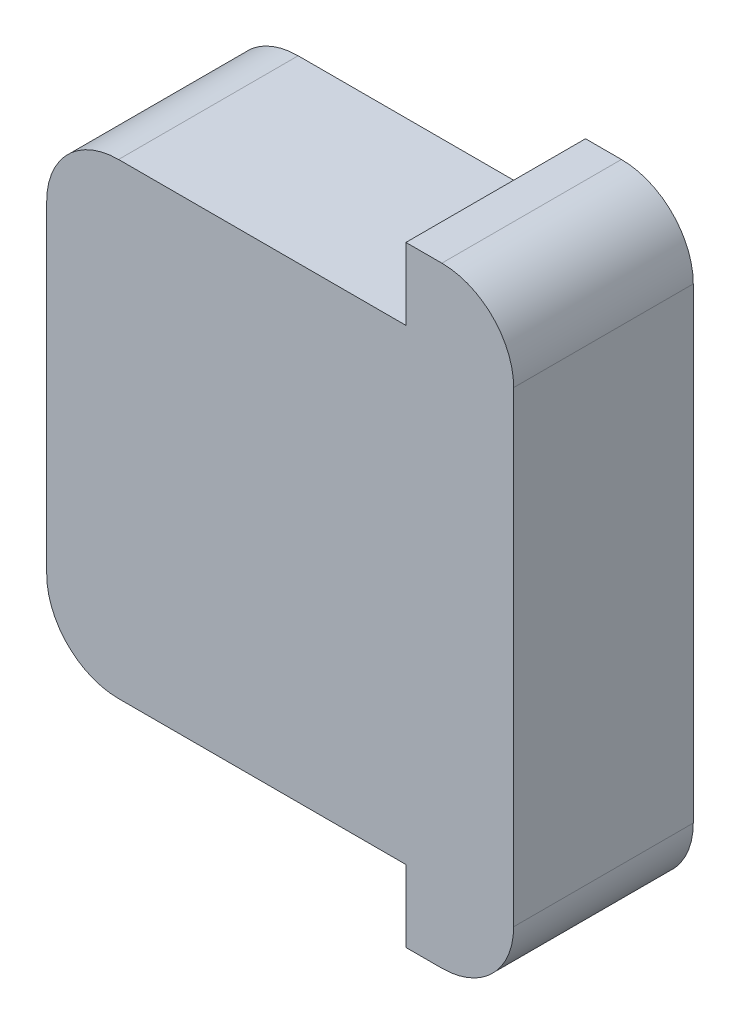
ISO-10303-21;
HEADER;
FILE_DESCRIPTION(('STEP AP214'),'2;1');
FILE_NAME('part.step','',(''),(''),'','','');
FILE_SCHEMA(('AUTOMOTIVE_DESIGN { 1 0 10303 214 1 1 1 1 }'));
ENDSEC;
DATA;
#1=APPLICATION_CONTEXT('core data for automotive mechanical design processes');
#2=APPLICATION_PROTOCOL_DEFINITION('international standard','automotive_design',2000,#1);
#3=PRODUCT_CONTEXT('',#1,'mechanical');
#4=PRODUCT('Part','Part','',(#3));
#5=PRODUCT_RELATED_PRODUCT_CATEGORY('part','',(#4));
#6=PRODUCT_DEFINITION_FORMATION('','',#4);
#7=PRODUCT_DEFINITION_CONTEXT('part definition',#1,'design');
#8=PRODUCT_DEFINITION('design','',#6,#7);
#9=PRODUCT_DEFINITION_SHAPE('','',#8);
#10=(LENGTH_UNIT() NAMED_UNIT(*) SI_UNIT(.MILLI.,.METRE.));
#11=(NAMED_UNIT(*) PLANE_ANGLE_UNIT() SI_UNIT($,.RADIAN.));
#12=(NAMED_UNIT(*) SI_UNIT($,.STERADIAN.) SOLID_ANGLE_UNIT());
#13=UNCERTAINTY_MEASURE_WITH_UNIT(LENGTH_MEASURE(1.E-05),#10,'distance_accuracy_value','');
#14=(GEOMETRIC_REPRESENTATION_CONTEXT(3) GLOBAL_UNCERTAINTY_ASSIGNED_CONTEXT((#13)) GLOBAL_UNIT_ASSIGNED_CONTEXT((#10,
#11,#12)) REPRESENTATION_CONTEXT('',''));
#15=CARTESIAN_POINT('',(0.,0.,0.));
#16=DIRECTION('',(0.,0.,1.));
#17=DIRECTION('',(1.,0.,0.));
#18=AXIS2_PLACEMENT_3D('',#15,#16,#17);
#19=CARTESIAN_POINT('',(-10.,6.5,5.));
#20=DIRECTION('',(1.,0.,0.));
#21=DIRECTION('',(0.,1.,0.));
#22=AXIS2_PLACEMENT_3D('',#19,#20,#21);
#23=PLANE('',#22);
#24=DIRECTION('',(0.,-1.,0.));
#25=VECTOR('',#24,1.);
#26=CARTESIAN_POINT('',(-10.,6.5,0.));
#27=LINE('',#26,#25);
#28=CARTESIAN_POINT('',(-10.,4.5,0.));
#29=VERTEX_POINT('',#28);
#30=CARTESIAN_POINT('',(-10.,-4.5,0.));
#31=VERTEX_POINT('',#30);
#32=EDGE_CURVE('E167',#29,#31,#27,.T.);
#33=ORIENTED_EDGE('',*,*,#32,.T.);
#34=DIRECTION('',(0.,0.,-1.));
#35=VECTOR('',#34,1.);
#36=CARTESIAN_POINT('',(-10.,-4.5,5.));
#37=LINE('',#36,#35);
#38=CARTESIAN_POINT('',(-10.,-4.5,5.));
#39=VERTEX_POINT('',#38);
#40=EDGE_CURVE('E203',#31,#39,#37,.F.);
#41=ORIENTED_EDGE('',*,*,#40,.T.);
#42=DIRECTION('',(0.,-1.,0.));
#43=VECTOR('',#42,1.);
#44=CARTESIAN_POINT('',(-10.,6.5,5.));
#45=LINE('',#44,#43);
#46=CARTESIAN_POINT('',(-10.,4.5,5.));
#47=VERTEX_POINT('',#46);
#48=EDGE_CURVE('E138',#47,#39,#45,.T.);
#49=ORIENTED_EDGE('',*,*,#48,.F.);
#50=DIRECTION('',(0.,0.,-1.));
#51=VECTOR('',#50,1.);
#52=CARTESIAN_POINT('',(-10.,4.5,5.));
#53=LINE('',#52,#51);
#54=EDGE_CURVE('E200',#47,#29,#53,.T.);
#55=ORIENTED_EDGE('',*,*,#54,.T.);
#56=EDGE_LOOP('',(#33,#41,#49,#55));
#57=FACE_BOUND('',#56,.T.);
#58=ADVANCED_FACE('F37',(#57),#23,.F.);
#59=CARTESIAN_POINT('',(-10.,-6.5,5.));
#60=DIRECTION('',(0.,1.,0.));
#61=DIRECTION('',(-1.,0.,0.));
#62=AXIS2_PLACEMENT_3D('',#59,#60,#61);
#63=PLANE('',#62);
#64=DIRECTION('',(1.,0.,0.));
#65=VECTOR('',#64,1.);
#66=CARTESIAN_POINT('',(-10.,-6.5,5.));
#67=LINE('',#66,#65);
#68=CARTESIAN_POINT('',(-8.,-6.5,5.));
#69=VERTEX_POINT('',#68);
#70=CARTESIAN_POINT('',(0.,-6.5,5.));
#71=VERTEX_POINT('',#70);
#72=EDGE_CURVE('E125',#69,#71,#67,.T.);
#73=ORIENTED_EDGE('',*,*,#72,.F.);
#74=DIRECTION('',(0.,0.,-1.));
#75=VECTOR('',#74,1.);
#76=CARTESIAN_POINT('',(-8.,-6.5,5.));
#77=LINE('',#76,#75);
#78=CARTESIAN_POINT('',(-8.,-6.5,0.));
#79=VERTEX_POINT('',#78);
#80=EDGE_CURVE('E147',#69,#79,#77,.T.);
#81=ORIENTED_EDGE('',*,*,#80,.T.);
#82=DIRECTION('',(1.,0.,0.));
#83=VECTOR('',#82,1.);
#84=CARTESIAN_POINT('',(-10.,-6.5,0.));
#85=LINE('',#84,#83);
#86=CARTESIAN_POINT('',(0.,-6.5,0.));
#87=VERTEX_POINT('',#86);
#88=EDGE_CURVE('E144',#79,#87,#85,.T.);
#89=ORIENTED_EDGE('',*,*,#88,.T.);
#90=DIRECTION('',(0.,0.,-1.));
#91=VECTOR('',#90,1.);
#92=CARTESIAN_POINT('',(0.,-6.5,5.));
#93=LINE('',#92,#91);
#94=EDGE_CURVE('E141',#71,#87,#93,.T.);
#95=ORIENTED_EDGE('',*,*,#94,.F.);
#96=EDGE_LOOP('',(#73,#81,#89,#95));
#97=FACE_BOUND('',#96,.T.);
#98=ADVANCED_FACE('F142',(#97),#63,.F.);
#99=CARTESIAN_POINT('',(0.,-8.5,5.));
#100=DIRECTION('',(1.,0.,0.));
#101=DIRECTION('',(0.,1.,0.));
#102=AXIS2_PLACEMENT_3D('',#99,#100,#101);
#103=PLANE('',#102);
#104=DIRECTION('',(0.,-1.,0.));
#105=VECTOR('',#104,1.);
#106=CARTESIAN_POINT('',(0.,-8.5,0.));
#107=LINE('',#106,#105);
#108=CARTESIAN_POINT('',(0.,-8.5,0.));
#109=VERTEX_POINT('',#108);
#110=EDGE_CURVE('E171',#87,#109,#107,.T.);
#111=ORIENTED_EDGE('',*,*,#110,.T.);
#112=DIRECTION('',(0.,0.,-1.));
#113=VECTOR('',#112,1.);
#114=CARTESIAN_POINT('',(0.,-8.5,5.));
#115=LINE('',#114,#113);
#116=CARTESIAN_POINT('',(0.,-8.5,5.));
#117=VERTEX_POINT('',#116);
#118=EDGE_CURVE('E148',#117,#109,#115,.T.);
#119=ORIENTED_EDGE('',*,*,#118,.F.);
#120=DIRECTION('',(0.,-1.,0.));
#121=VECTOR('',#120,1.);
#122=CARTESIAN_POINT('',(0.,-8.5,5.));
#123=LINE('',#122,#121);
#124=EDGE_CURVE('E131',#71,#117,#123,.T.);
#125=ORIENTED_EDGE('',*,*,#124,.F.);
#126=ORIENTED_EDGE('',*,*,#94,.T.);
#127=EDGE_LOOP('',(#111,#119,#125,#126));
#128=FACE_BOUND('',#127,.T.);
#129=ADVANCED_FACE('F150',(#128),#103,.F.);
#130=CARTESIAN_POINT('',(3.,-8.5,5.));
#131=DIRECTION('',(0.,1.,0.));
#132=DIRECTION('',(0.,0.,1.));
#133=AXIS2_PLACEMENT_3D('',#130,#131,#132);
#134=PLANE('',#133);
#135=DIRECTION('',(1.,0.,0.));
#136=VECTOR('',#135,1.);
#137=CARTESIAN_POINT('',(3.,-8.5,0.));
#138=LINE('',#137,#136);
#139=CARTESIAN_POINT('',(1.,-8.5,0.));
#140=VERTEX_POINT('',#139);
#141=EDGE_CURVE('E173',#109,#140,#138,.T.);
#142=ORIENTED_EDGE('',*,*,#141,.T.);
#143=DIRECTION('',(0.,0.,-1.));
#144=VECTOR('',#143,1.);
#145=CARTESIAN_POINT('',(1.,-8.5,5.));
#146=LINE('',#145,#144);
#147=CARTESIAN_POINT('',(1.,-8.5,5.));
#148=VERTEX_POINT('',#147);
#149=EDGE_CURVE('E216',#140,#148,#146,.F.);
#150=ORIENTED_EDGE('',*,*,#149,.T.);
#151=DIRECTION('',(1.,0.,0.));
#152=VECTOR('',#151,1.);
#153=CARTESIAN_POINT('',(3.,-8.5,5.));
#154=LINE('',#153,#152);
#155=EDGE_CURVE('E153',#117,#148,#154,.T.);
#156=ORIENTED_EDGE('',*,*,#155,.F.);
#157=ORIENTED_EDGE('',*,*,#118,.T.);
#158=EDGE_LOOP('',(#142,#150,#156,#157));
#159=FACE_BOUND('',#158,.T.);
#160=ADVANCED_FACE('F263',(#159),#134,.F.);
#161=CARTESIAN_POINT('',(3.,8.5,5.));
#162=DIRECTION('',(-1.,0.,0.));
#163=DIRECTION('',(0.,-1.,0.));
#164=AXIS2_PLACEMENT_3D('',#161,#162,#163);
#165=PLANE('',#164);
#166=DIRECTION('',(0.,1.,0.));
#167=VECTOR('',#166,1.);
#168=CARTESIAN_POINT('',(3.,8.5,5.));
#169=LINE('',#168,#167);
#170=CARTESIAN_POINT('',(3.,-6.5,5.));
#171=VERTEX_POINT('',#170);
#172=CARTESIAN_POINT('',(3.,6.5,5.));
#173=VERTEX_POINT('',#172);
#174=EDGE_CURVE('E155',#171,#173,#169,.T.);
#175=ORIENTED_EDGE('',*,*,#174,.F.);
#176=DIRECTION('',(0.,0.,-1.));
#177=VECTOR('',#176,1.);
#178=CARTESIAN_POINT('',(3.,-6.5,5.));
#179=LINE('',#178,#177);
#180=CARTESIAN_POINT('',(3.,-6.5,0.));
#181=VERTEX_POINT('',#180);
#182=EDGE_CURVE('E213',#171,#181,#179,.T.);
#183=ORIENTED_EDGE('',*,*,#182,.T.);
#184=DIRECTION('',(0.,1.,0.));
#185=VECTOR('',#184,1.);
#186=CARTESIAN_POINT('',(3.,8.5,0.));
#187=LINE('',#186,#185);
#188=CARTESIAN_POINT('',(3.,6.5,0.));
#189=VERTEX_POINT('',#188);
#190=EDGE_CURVE('E176',#181,#189,#187,.T.);
#191=ORIENTED_EDGE('',*,*,#190,.T.);
#192=DIRECTION('',(0.,0.,-1.));
#193=VECTOR('',#192,1.);
#194=CARTESIAN_POINT('',(3.,6.5,5.));
#195=LINE('',#194,#193);
#196=EDGE_CURVE('E211',#189,#173,#195,.F.);
#197=ORIENTED_EDGE('',*,*,#196,.T.);
#198=EDGE_LOOP('',(#175,#183,#191,#197));
#199=FACE_BOUND('',#198,.T.);
#200=ADVANCED_FACE('F266',(#199),#165,.F.);
#201=CARTESIAN_POINT('',(0.,8.5,5.));
#202=DIRECTION('',(0.,-1.,0.));
#203=DIRECTION('',(0.,0.,-1.));
#204=AXIS2_PLACEMENT_3D('',#201,#202,#203);
#205=PLANE('',#204);
#206=DIRECTION('',(-1.,0.,0.));
#207=VECTOR('',#206,1.);
#208=CARTESIAN_POINT('',(0.,8.5,5.));
#209=LINE('',#208,#207);
#210=CARTESIAN_POINT('',(1.,8.5,5.));
#211=VERTEX_POINT('',#210);
#212=CARTESIAN_POINT('',(0.,8.5,5.));
#213=VERTEX_POINT('',#212);
#214=EDGE_CURVE('E160',#211,#213,#209,.T.);
#215=ORIENTED_EDGE('',*,*,#214,.F.);
#216=DIRECTION('',(0.,0.,-1.));
#217=VECTOR('',#216,1.);
#218=CARTESIAN_POINT('',(1.,8.5,5.));
#219=LINE('',#218,#217);
#220=CARTESIAN_POINT('',(1.,8.5,0.));
#221=VERTEX_POINT('',#220);
#222=EDGE_CURVE('E45',#211,#221,#219,.T.);
#223=ORIENTED_EDGE('',*,*,#222,.T.);
#224=DIRECTION('',(-1.,0.,0.));
#225=VECTOR('',#224,1.);
#226=CARTESIAN_POINT('',(0.,8.5,0.));
#227=LINE('',#226,#225);
#228=CARTESIAN_POINT('',(0.,8.5,0.));
#229=VERTEX_POINT('',#228);
#230=EDGE_CURVE('E179',#221,#229,#227,.T.);
#231=ORIENTED_EDGE('',*,*,#230,.T.);
#232=DIRECTION('',(0.,0.,-1.));
#233=VECTOR('',#232,1.);
#234=CARTESIAN_POINT('',(0.,8.5,5.));
#235=LINE('',#234,#233);
#236=EDGE_CURVE('E187',#213,#229,#235,.T.);
#237=ORIENTED_EDGE('',*,*,#236,.F.);
#238=EDGE_LOOP('',(#215,#223,#231,#237));
#239=FACE_BOUND('',#238,.T.);
#240=ADVANCED_FACE('F221',(#239),#205,.F.);
#241=CARTESIAN_POINT('',(0.,6.5,5.));
#242=DIRECTION('',(1.,0.,0.));
#243=DIRECTION('',(0.,0.,-1.));
#244=AXIS2_PLACEMENT_3D('',#241,#242,#243);
#245=PLANE('',#244);
#246=DIRECTION('',(0.,-1.,0.));
#247=VECTOR('',#246,1.);
#248=CARTESIAN_POINT('',(0.,6.5,0.));
#249=LINE('',#248,#247);
#250=CARTESIAN_POINT('',(0.,6.5,0.));
#251=VERTEX_POINT('',#250);
#252=EDGE_CURVE('E181',#229,#251,#249,.T.);
#253=ORIENTED_EDGE('',*,*,#252,.T.);
#254=DIRECTION('',(0.,0.,-1.));
#255=VECTOR('',#254,1.);
#256=CARTESIAN_POINT('',(0.,6.5,5.));
#257=LINE('',#256,#255);
#258=CARTESIAN_POINT('',(0.,6.5,5.));
#259=VERTEX_POINT('',#258);
#260=EDGE_CURVE('E166',#259,#251,#257,.T.);
#261=ORIENTED_EDGE('',*,*,#260,.F.);
#262=DIRECTION('',(0.,-1.,0.));
#263=VECTOR('',#262,1.);
#264=CARTESIAN_POINT('',(0.,6.5,5.));
#265=LINE('',#264,#263);
#266=EDGE_CURVE('E162',#213,#259,#265,.T.);
#267=ORIENTED_EDGE('',*,*,#266,.F.);
#268=ORIENTED_EDGE('',*,*,#236,.T.);
#269=EDGE_LOOP('',(#253,#261,#267,#268));
#270=FACE_BOUND('',#269,.T.);
#271=ADVANCED_FACE('F231',(#270),#245,.F.);
#272=CARTESIAN_POINT('',(-10.,6.5,5.));
#273=DIRECTION('',(0.,-1.,0.));
#274=DIRECTION('',(0.,0.,-1.));
#275=AXIS2_PLACEMENT_3D('',#272,#273,#274);
#276=PLANE('',#275);
#277=DIRECTION('',(-1.,0.,0.));
#278=VECTOR('',#277,1.);
#279=CARTESIAN_POINT('',(-10.,6.5,0.));
#280=LINE('',#279,#278);
#281=CARTESIAN_POINT('',(-8.,6.5,0.));
#282=VERTEX_POINT('',#281);
#283=EDGE_CURVE('E183',#251,#282,#280,.T.);
#284=ORIENTED_EDGE('',*,*,#283,.T.);
#285=DIRECTION('',(0.,0.,-1.));
#286=VECTOR('',#285,1.);
#287=CARTESIAN_POINT('',(-8.,6.5,5.));
#288=LINE('',#287,#286);
#289=CARTESIAN_POINT('',(-8.,6.5,5.));
#290=VERTEX_POINT('',#289);
#291=EDGE_CURVE('E11',#282,#290,#288,.F.);
#292=ORIENTED_EDGE('',*,*,#291,.T.);
#293=DIRECTION('',(-1.,0.,0.));
#294=VECTOR('',#293,1.);
#295=CARTESIAN_POINT('',(-10.,6.5,5.));
#296=LINE('',#295,#294);
#297=EDGE_CURVE('E164',#259,#290,#296,.T.);
#298=ORIENTED_EDGE('',*,*,#297,.F.);
#299=ORIENTED_EDGE('',*,*,#260,.T.);
#300=EDGE_LOOP('',(#284,#292,#298,#299));
#301=FACE_BOUND('',#300,.T.);
#302=ADVANCED_FACE('F233',(#301),#276,.F.);
#303=CARTESIAN_POINT('',(0.,0.,5.));
#304=DIRECTION('',(0.,0.,1.));
#305=DIRECTION('',(1.,0.,0.));
#306=AXIS2_PLACEMENT_3D('',#303,#304,#305);
#307=PLANE('',#306);
#308=ORIENTED_EDGE('',*,*,#48,.T.);
#309=CARTESIAN_POINT('',(-8.,-4.5,5.));
#310=DIRECTION('',(0.,0.,1.));
#311=DIRECTION('',(1.,0.,0.));
#312=AXIS2_PLACEMENT_3D('',#309,#310,#311);
#313=CIRCLE('',#312,2.);
#314=EDGE_CURVE('E134',#39,#69,#313,.T.);
#315=ORIENTED_EDGE('',*,*,#314,.T.);
#316=ORIENTED_EDGE('',*,*,#72,.T.);
#317=ORIENTED_EDGE('',*,*,#124,.T.);
#318=ORIENTED_EDGE('',*,*,#155,.T.);
#319=CARTESIAN_POINT('',(1.,-6.5,5.));
#320=DIRECTION('',(0.,0.,1.));
#321=DIRECTION('',(1.,0.,0.));
#322=AXIS2_PLACEMENT_3D('',#319,#320,#321);
#323=CIRCLE('',#322,2.);
#324=EDGE_CURVE('E208',#148,#171,#323,.T.);
#325=ORIENTED_EDGE('',*,*,#324,.T.);
#326=ORIENTED_EDGE('',*,*,#174,.T.);
#327=CARTESIAN_POINT('',(1.,6.5,5.));
#328=DIRECTION('',(0.,0.,1.));
#329=DIRECTION('',(1.,0.,0.));
#330=AXIS2_PLACEMENT_3D('',#327,#328,#329);
#331=CIRCLE('',#330,2.);
#332=EDGE_CURVE('E58',#173,#211,#331,.T.);
#333=ORIENTED_EDGE('',*,*,#332,.T.);
#334=ORIENTED_EDGE('',*,*,#214,.T.);
#335=ORIENTED_EDGE('',*,*,#266,.T.);
#336=ORIENTED_EDGE('',*,*,#297,.T.);
#337=CARTESIAN_POINT('',(-8.,4.5,5.));
#338=DIRECTION('',(0.,0.,1.));
#339=DIRECTION('',(1.,0.,0.));
#340=AXIS2_PLACEMENT_3D('',#337,#338,#339);
#341=CIRCLE('',#340,2.);
#342=EDGE_CURVE('E205',#290,#47,#341,.T.);
#343=ORIENTED_EDGE('',*,*,#342,.T.);
#344=EDGE_LOOP('',(#308,#315,#316,#317,#318,#325,#326,#333,#334,#335,#336,#343));
#345=FACE_BOUND('',#344,.T.);
#346=ADVANCED_FACE('F128',(#345),#307,.T.);
#347=CARTESIAN_POINT('',(0.,0.,0.));
#348=DIRECTION('',(0.,0.,1.));
#349=DIRECTION('',(1.,0.,0.));
#350=AXIS2_PLACEMENT_3D('',#347,#348,#349);
#351=PLANE('',#350);
#352=ORIENTED_EDGE('',*,*,#88,.F.);
#353=CARTESIAN_POINT('',(-8.,-4.5,0.));
#354=DIRECTION('',(0.,0.,1.));
#355=DIRECTION('',(1.,0.,0.));
#356=AXIS2_PLACEMENT_3D('',#353,#354,#355);
#357=CIRCLE('',#356,2.);
#358=EDGE_CURVE('E198',#79,#31,#357,.F.);
#359=ORIENTED_EDGE('',*,*,#358,.T.);
#360=ORIENTED_EDGE('',*,*,#32,.F.);
#361=CARTESIAN_POINT('',(-8.,4.5,0.));
#362=DIRECTION('',(0.,0.,1.));
#363=DIRECTION('',(1.,0.,0.));
#364=AXIS2_PLACEMENT_3D('',#361,#362,#363);
#365=CIRCLE('',#364,2.);
#366=EDGE_CURVE('E192',#29,#282,#365,.F.);
#367=ORIENTED_EDGE('',*,*,#366,.T.);
#368=ORIENTED_EDGE('',*,*,#283,.F.);
#369=ORIENTED_EDGE('',*,*,#252,.F.);
#370=ORIENTED_EDGE('',*,*,#230,.F.);
#371=CARTESIAN_POINT('',(1.,6.5,0.));
#372=DIRECTION('',(0.,0.,1.));
#373=DIRECTION('',(1.,0.,0.));
#374=AXIS2_PLACEMENT_3D('',#371,#372,#373);
#375=CIRCLE('',#374,2.);
#376=EDGE_CURVE('E194',#221,#189,#375,.F.);
#377=ORIENTED_EDGE('',*,*,#376,.T.);
#378=ORIENTED_EDGE('',*,*,#190,.F.);
#379=CARTESIAN_POINT('',(1.,-6.5,0.));
#380=DIRECTION('',(0.,0.,1.));
#381=DIRECTION('',(1.,0.,0.));
#382=AXIS2_PLACEMENT_3D('',#379,#380,#381);
#383=CIRCLE('',#382,2.);
#384=EDGE_CURVE('E196',#181,#140,#383,.F.);
#385=ORIENTED_EDGE('',*,*,#384,.T.);
#386=ORIENTED_EDGE('',*,*,#141,.F.);
#387=ORIENTED_EDGE('',*,*,#110,.F.);
#388=EDGE_LOOP('',(#352,#359,#360,#367,#368,#369,#370,#377,#378,#385,#386,#387));
#389=FACE_BOUND('',#388,.T.);
#390=ADVANCED_FACE('F226',(#389),#351,.F.);
#391=CARTESIAN_POINT('',(-8.,-4.5,5.));
#392=DIRECTION('',(0.,0.,-1.));
#393=DIRECTION('',(-1.,0.,0.));
#394=AXIS2_PLACEMENT_3D('',#391,#392,#393);
#395=CYLINDRICAL_SURFACE('',#394,2.);
#396=ORIENTED_EDGE('',*,*,#314,.F.);
#397=ORIENTED_EDGE('',*,*,#40,.F.);
#398=ORIENTED_EDGE('',*,*,#358,.F.);
#399=ORIENTED_EDGE('',*,*,#80,.F.);
#400=EDGE_LOOP('',(#396,#397,#398,#399));
#401=FACE_BOUND('',#400,.T.);
#402=ADVANCED_FACE('F242',(#401),#395,.T.);
#403=CARTESIAN_POINT('',(1.,-6.5,5.));
#404=DIRECTION('',(0.,0.,-1.));
#405=DIRECTION('',(-1.,0.,0.));
#406=AXIS2_PLACEMENT_3D('',#403,#404,#405);
#407=CYLINDRICAL_SURFACE('',#406,2.);
#408=ORIENTED_EDGE('',*,*,#324,.F.);
#409=ORIENTED_EDGE('',*,*,#149,.F.);
#410=ORIENTED_EDGE('',*,*,#384,.F.);
#411=ORIENTED_EDGE('',*,*,#182,.F.);
#412=EDGE_LOOP('',(#408,#409,#410,#411));
#413=FACE_BOUND('',#412,.T.);
#414=ADVANCED_FACE('F244',(#413),#407,.T.);
#415=CARTESIAN_POINT('',(1.,6.5,5.));
#416=DIRECTION('',(0.,0.,-1.));
#417=DIRECTION('',(-1.,0.,0.));
#418=AXIS2_PLACEMENT_3D('',#415,#416,#417);
#419=CYLINDRICAL_SURFACE('',#418,2.);
#420=ORIENTED_EDGE('',*,*,#332,.F.);
#421=ORIENTED_EDGE('',*,*,#196,.F.);
#422=ORIENTED_EDGE('',*,*,#376,.F.);
#423=ORIENTED_EDGE('',*,*,#222,.F.);
#424=EDGE_LOOP('',(#420,#421,#422,#423));
#425=FACE_BOUND('',#424,.T.);
#426=ADVANCED_FACE('F250',(#425),#419,.T.);
#427=CARTESIAN_POINT('',(-8.,4.5,5.));
#428=DIRECTION('',(0.,0.,-1.));
#429=DIRECTION('',(-1.,0.,0.));
#430=AXIS2_PLACEMENT_3D('',#427,#428,#429);
#431=CYLINDRICAL_SURFACE('',#430,2.);
#432=ORIENTED_EDGE('',*,*,#342,.F.);
#433=ORIENTED_EDGE('',*,*,#291,.F.);
#434=ORIENTED_EDGE('',*,*,#366,.F.);
#435=ORIENTED_EDGE('',*,*,#54,.F.);
#436=EDGE_LOOP('',(#432,#433,#434,#435));
#437=FACE_BOUND('',#436,.T.);
#438=ADVANCED_FACE('F39',(#437),#431,.T.);
#439=CLOSED_SHELL('',(#58,#98,#129,#160,#200,#240,#271,#302,#346,#390,#402,#414,#426,#438));
#440=MANIFOLD_SOLID_BREP('B2',#439);
#441=ADVANCED_BREP_SHAPE_REPRESENTATION('',(#18,#440),#14);
#442=SHAPE_DEFINITION_REPRESENTATION(#9,#441);
ENDSEC;
END-ISO-10303-21;
